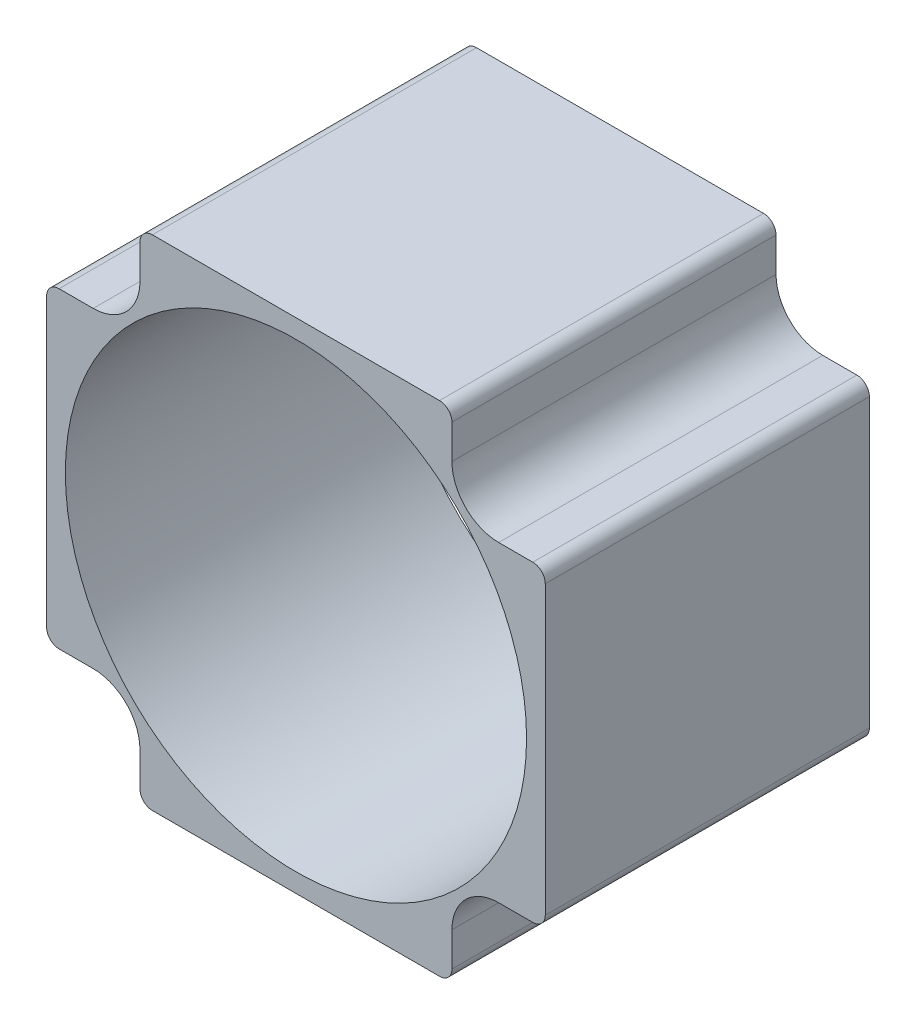
ISO-10303-21;
HEADER;
FILE_DESCRIPTION(('STEP AP214'),'2;1');
FILE_NAME('part.step','',(''),(''),'','','');
FILE_SCHEMA(('AUTOMOTIVE_DESIGN { 1 0 10303 214 1 1 1 1 }'));
ENDSEC;
DATA;
#1=APPLICATION_CONTEXT('core data for automotive mechanical design processes');
#2=APPLICATION_PROTOCOL_DEFINITION('international standard','automotive_design',2000,#1);
#3=PRODUCT_CONTEXT('',#1,'mechanical');
#4=PRODUCT('Part','Part','',(#3));
#5=PRODUCT_RELATED_PRODUCT_CATEGORY('part','',(#4));
#6=PRODUCT_DEFINITION_FORMATION('','',#4);
#7=PRODUCT_DEFINITION_CONTEXT('part definition',#1,'design');
#8=PRODUCT_DEFINITION('design','',#6,#7);
#9=PRODUCT_DEFINITION_SHAPE('','',#8);
#10=(LENGTH_UNIT() NAMED_UNIT(*) SI_UNIT(.MILLI.,.METRE.));
#11=(NAMED_UNIT(*) PLANE_ANGLE_UNIT() SI_UNIT($,.RADIAN.));
#12=(NAMED_UNIT(*) SI_UNIT($,.STERADIAN.) SOLID_ANGLE_UNIT());
#13=UNCERTAINTY_MEASURE_WITH_UNIT(LENGTH_MEASURE(1.E-05),#10,'distance_accuracy_value','');
#14=(GEOMETRIC_REPRESENTATION_CONTEXT(3) GLOBAL_UNCERTAINTY_ASSIGNED_CONTEXT((#13)) GLOBAL_UNIT_ASSIGNED_CONTEXT((#10,
#11,#12)) REPRESENTATION_CONTEXT('',''));
#15=CARTESIAN_POINT('',(0.,0.,0.));
#16=DIRECTION('',(0.,0.,1.));
#17=DIRECTION('',(1.,0.,0.));
#18=AXIS2_PLACEMENT_3D('',#15,#16,#17);
#19=CARTESIAN_POINT('',(0.,0.,-7.));
#20=DIRECTION('',(0.,0.,-1.));
#21=DIRECTION('',(-1.,0.,0.));
#22=AXIS2_PLACEMENT_3D('',#19,#20,#21);
#23=PLANE('',#22);
#24=CARTESIAN_POINT('',(0.,0.,-7.));
#25=DIRECTION('',(0.,0.,1.));
#26=DIRECTION('',(1.,0.,0.));
#27=AXIS2_PLACEMENT_3D('',#24,#25,#26);
#28=CIRCLE('',#27,18.5);
#29=CARTESIAN_POINT('',(18.5,0.,-7.));
#30=VERTEX_POINT('',#29);
#31=EDGE_CURVE('E314',#30,#30,#28,.T.);
#32=ORIENTED_EDGE('',*,*,#31,.F.);
#33=EDGE_LOOP('',(#32));
#34=FACE_BOUND('',#33,.T.);
#35=DIRECTION('',(1.,0.,0.));
#36=VECTOR('',#35,1.);
#37=CARTESIAN_POINT('',(-16.2634559672906,20.,-7.));
#38=LINE('',#37,#36);
#39=CARTESIAN_POINT('',(-11.5134559672906,20.,-7.));
#40=VERTEX_POINT('',#39);
#41=CARTESIAN_POINT('',(11.5134559672906,20.,-7.));
#42=VERTEX_POINT('',#41);
#43=EDGE_CURVE('E320',#40,#42,#38,.T.);
#44=ORIENTED_EDGE('',*,*,#43,.F.);
#45=CARTESIAN_POINT('',(-11.5134559672906,19.,-7.));
#46=DIRECTION('',(0.,0.,-1.));
#47=DIRECTION('',(-1.,0.,0.));
#48=AXIS2_PLACEMENT_3D('',#45,#46,#47);
#49=CIRCLE('',#48,1.);
#50=CARTESIAN_POINT('',(-12.5134559672906,19.,-7.));
#51=VERTEX_POINT('',#50);
#52=EDGE_CURVE('E362',#40,#51,#49,.F.);
#53=ORIENTED_EDGE('',*,*,#52,.T.);
#54=DIRECTION('',(0.,-1.,0.));
#55=VECTOR('',#54,1.);
#56=CARTESIAN_POINT('',(-12.5134559672906,0.,-7.));
#57=LINE('',#56,#55);
#58=CARTESIAN_POINT('',(-12.5134559672906,16.2634559672906,-7.));
#59=VERTEX_POINT('',#58);
#60=EDGE_CURVE('E312',#51,#59,#57,.T.);
#61=ORIENTED_EDGE('',*,*,#60,.T.);
#62=CARTESIAN_POINT('',(-16.2634559672906,16.2634559672906,-7.));
#63=DIRECTION('',(0.,0.,-1.));
#64=DIRECTION('',(-1.,0.,0.));
#65=AXIS2_PLACEMENT_3D('',#62,#63,#64);
#66=CIRCLE('',#65,3.75);
#67=CARTESIAN_POINT('',(-16.2634559672906,12.5134559672906,-7.));
#68=VERTEX_POINT('',#67);
#69=EDGE_CURVE('E309',#59,#68,#66,.T.);
#70=ORIENTED_EDGE('',*,*,#69,.T.);
#71=DIRECTION('',(-1.,0.,0.));
#72=VECTOR('',#71,1.);
#73=CARTESIAN_POINT('',(0.,12.5134559672906,-7.));
#74=LINE('',#73,#72);
#75=CARTESIAN_POINT('',(-19.,12.5134559672906,-7.));
#76=VERTEX_POINT('',#75);
#77=EDGE_CURVE('E306',#68,#76,#74,.T.);
#78=ORIENTED_EDGE('',*,*,#77,.T.);
#79=CARTESIAN_POINT('',(-19.,11.5134559672906,-7.));
#80=DIRECTION('',(0.,0.,-1.));
#81=DIRECTION('',(-1.,0.,0.));
#82=AXIS2_PLACEMENT_3D('',#79,#80,#81);
#83=CIRCLE('',#82,1.);
#84=CARTESIAN_POINT('',(-20.,11.5134559672906,-7.));
#85=VERTEX_POINT('',#84);
#86=EDGE_CURVE('E360',#76,#85,#83,.F.);
#87=ORIENTED_EDGE('',*,*,#86,.T.);
#88=DIRECTION('',(0.,1.,0.));
#89=VECTOR('',#88,1.);
#90=CARTESIAN_POINT('',(-20.,16.2634559672906,-7.));
#91=LINE('',#90,#89);
#92=CARTESIAN_POINT('',(-20.,-11.5134559672906,-7.));
#93=VERTEX_POINT('',#92);
#94=EDGE_CURVE('E338',#93,#85,#91,.T.);
#95=ORIENTED_EDGE('',*,*,#94,.F.);
#96=CARTESIAN_POINT('',(-19.,-11.5134559672906,-7.));
#97=DIRECTION('',(0.,0.,-1.));
#98=DIRECTION('',(-1.,0.,0.));
#99=AXIS2_PLACEMENT_3D('',#96,#97,#98);
#100=CIRCLE('',#99,1.);
#101=CARTESIAN_POINT('',(-19.,-12.5134559672906,-7.));
#102=VERTEX_POINT('',#101);
#103=EDGE_CURVE('E358',#93,#102,#100,.F.);
#104=ORIENTED_EDGE('',*,*,#103,.T.);
#105=DIRECTION('',(1.,0.,0.));
#106=VECTOR('',#105,1.);
#107=CARTESIAN_POINT('',(0.,-12.5134559672906,-7.));
#108=LINE('',#107,#106);
#109=CARTESIAN_POINT('',(-16.2634559672906,-12.5134559672906,-7.));
#110=VERTEX_POINT('',#109);
#111=EDGE_CURVE('E290',#102,#110,#108,.T.);
#112=ORIENTED_EDGE('',*,*,#111,.T.);
#113=CARTESIAN_POINT('',(-16.2634559672906,-16.2634559672906,-7.));
#114=DIRECTION('',(0.,0.,-1.));
#115=DIRECTION('',(-1.,0.,0.));
#116=AXIS2_PLACEMENT_3D('',#113,#114,#115);
#117=CIRCLE('',#116,3.75);
#118=CARTESIAN_POINT('',(-12.5134559672906,-16.2634559672906,-7.));
#119=VERTEX_POINT('',#118);
#120=EDGE_CURVE('E287',#110,#119,#117,.T.);
#121=ORIENTED_EDGE('',*,*,#120,.T.);
#122=DIRECTION('',(0.,-1.,0.));
#123=VECTOR('',#122,1.);
#124=CARTESIAN_POINT('',(-12.5134559672906,0.,-7.));
#125=LINE('',#124,#123);
#126=CARTESIAN_POINT('',(-12.5134559672906,-19.,-7.));
#127=VERTEX_POINT('',#126);
#128=EDGE_CURVE('E282',#119,#127,#125,.T.);
#129=ORIENTED_EDGE('',*,*,#128,.T.);
#130=CARTESIAN_POINT('',(-11.5134559672906,-19.,-7.));
#131=DIRECTION('',(0.,0.,-1.));
#132=DIRECTION('',(-1.,0.,0.));
#133=AXIS2_PLACEMENT_3D('',#130,#131,#132);
#134=CIRCLE('',#133,1.);
#135=CARTESIAN_POINT('',(-11.5134559672906,-20.,-7.));
#136=VERTEX_POINT('',#135);
#137=EDGE_CURVE('E356',#127,#136,#134,.F.);
#138=ORIENTED_EDGE('',*,*,#137,.T.);
#139=DIRECTION('',(-1.,0.,0.));
#140=VECTOR('',#139,1.);
#141=CARTESIAN_POINT('',(-16.2634559672906,-20.,-7.));
#142=LINE('',#141,#140);
#143=CARTESIAN_POINT('',(11.5134559672906,-20.,-7.));
#144=VERTEX_POINT('',#143);
#145=EDGE_CURVE('E332',#144,#136,#142,.T.);
#146=ORIENTED_EDGE('',*,*,#145,.F.);
#147=CARTESIAN_POINT('',(11.5134559672906,-19.,-7.));
#148=DIRECTION('',(0.,0.,-1.));
#149=DIRECTION('',(-1.,0.,0.));
#150=AXIS2_PLACEMENT_3D('',#147,#148,#149);
#151=CIRCLE('',#150,1.);
#152=CARTESIAN_POINT('',(12.5134559672906,-19.,-7.));
#153=VERTEX_POINT('',#152);
#154=EDGE_CURVE('E354',#144,#153,#151,.F.);
#155=ORIENTED_EDGE('',*,*,#154,.T.);
#156=DIRECTION('',(0.,1.,0.));
#157=VECTOR('',#156,1.);
#158=CARTESIAN_POINT('',(12.5134559672906,0.,-7.));
#159=LINE('',#158,#157);
#160=CARTESIAN_POINT('',(12.5134559672906,-16.2634559672906,-7.));
#161=VERTEX_POINT('',#160);
#162=EDGE_CURVE('E296',#153,#161,#159,.T.);
#163=ORIENTED_EDGE('',*,*,#162,.T.);
#164=CARTESIAN_POINT('',(16.2634559672906,-16.2634559672906,-7.));
#165=DIRECTION('',(0.,0.,-1.));
#166=DIRECTION('',(-1.,0.,0.));
#167=AXIS2_PLACEMENT_3D('',#164,#165,#166);
#168=CIRCLE('',#167,3.74999999999999);
#169=CARTESIAN_POINT('',(16.2634559672906,-12.5134559672906,-7.));
#170=VERTEX_POINT('',#169);
#171=EDGE_CURVE('E224',#161,#170,#168,.T.);
#172=ORIENTED_EDGE('',*,*,#171,.T.);
#173=DIRECTION('',(1.,0.,0.));
#174=VECTOR('',#173,1.);
#175=CARTESIAN_POINT('',(0.,-12.5134559672906,-7.));
#176=LINE('',#175,#174);
#177=CARTESIAN_POINT('',(19.,-12.5134559672906,-7.));
#178=VERTEX_POINT('',#177);
#179=EDGE_CURVE('E292',#170,#178,#176,.T.);
#180=ORIENTED_EDGE('',*,*,#179,.T.);
#181=CARTESIAN_POINT('',(19.,-11.5134559672906,-7.));
#182=DIRECTION('',(0.,0.,-1.));
#183=DIRECTION('',(-1.,0.,0.));
#184=AXIS2_PLACEMENT_3D('',#181,#182,#183);
#185=CIRCLE('',#184,1.);
#186=CARTESIAN_POINT('',(20.,-11.5134559672906,-7.));
#187=VERTEX_POINT('',#186);
#188=EDGE_CURVE('E352',#178,#187,#185,.F.);
#189=ORIENTED_EDGE('',*,*,#188,.T.);
#190=DIRECTION('',(0.,-1.,0.));
#191=VECTOR('',#190,1.);
#192=CARTESIAN_POINT('',(20.,16.2634559672906,-7.));
#193=LINE('',#192,#191);
#194=CARTESIAN_POINT('',(20.,11.5134559672906,-7.));
#195=VERTEX_POINT('',#194);
#196=EDGE_CURVE('E326',#195,#187,#193,.T.);
#197=ORIENTED_EDGE('',*,*,#196,.F.);
#198=CARTESIAN_POINT('',(19.,11.5134559672906,-7.));
#199=DIRECTION('',(0.,0.,-1.));
#200=DIRECTION('',(-1.,0.,0.));
#201=AXIS2_PLACEMENT_3D('',#198,#199,#200);
#202=CIRCLE('',#201,1.);
#203=CARTESIAN_POINT('',(19.,12.5134559672906,-7.));
#204=VERTEX_POINT('',#203);
#205=EDGE_CURVE('E350',#195,#204,#202,.F.);
#206=ORIENTED_EDGE('',*,*,#205,.T.);
#207=DIRECTION('',(-1.,0.,0.));
#208=VECTOR('',#207,1.);
#209=CARTESIAN_POINT('',(0.,12.5134559672906,-7.));
#210=LINE('',#209,#208);
#211=CARTESIAN_POINT('',(16.2634559672906,12.5134559672906,-7.));
#212=VERTEX_POINT('',#211);
#213=EDGE_CURVE('E304',#204,#212,#210,.T.);
#214=ORIENTED_EDGE('',*,*,#213,.T.);
#215=CARTESIAN_POINT('',(16.2634559672906,16.2634559672906,-7.));
#216=DIRECTION('',(0.,0.,-1.));
#217=DIRECTION('',(-1.,0.,0.));
#218=AXIS2_PLACEMENT_3D('',#215,#216,#217);
#219=CIRCLE('',#218,3.75);
#220=CARTESIAN_POINT('',(12.5134559672906,16.2634559672906,-7.));
#221=VERTEX_POINT('',#220);
#222=EDGE_CURVE('E301',#212,#221,#219,.T.);
#223=ORIENTED_EDGE('',*,*,#222,.T.);
#224=DIRECTION('',(0.,1.,0.));
#225=VECTOR('',#224,1.);
#226=CARTESIAN_POINT('',(12.5134559672906,0.,-7.));
#227=LINE('',#226,#225);
#228=CARTESIAN_POINT('',(12.5134559672906,19.,-7.));
#229=VERTEX_POINT('',#228);
#230=EDGE_CURVE('E298',#221,#229,#227,.T.);
#231=ORIENTED_EDGE('',*,*,#230,.T.);
#232=CARTESIAN_POINT('',(11.5134559672906,19.,-7.));
#233=DIRECTION('',(0.,0.,-1.));
#234=DIRECTION('',(-1.,0.,0.));
#235=AXIS2_PLACEMENT_3D('',#232,#233,#234);
#236=CIRCLE('',#235,1.);
#237=EDGE_CURVE('E348',#229,#42,#236,.F.);
#238=ORIENTED_EDGE('',*,*,#237,.T.);
#239=EDGE_LOOP('',(#44,#53,#61,#70,#78,#87,#95,#104,#112,#121,#129,#138,#146,#155,#163,#172,
#180,#189,#197,#206,#214,#223,#231,#238));
#240=FACE_BOUND('',#239,.T.);
#241=ADVANCED_FACE('F53',(#34,#240),#23,.F.);
#242=CARTESIAN_POINT('',(-16.2634559672906,20.,0.));
#243=DIRECTION('',(0.,-1.,0.));
#244=DIRECTION('',(0.,0.,-1.));
#245=AXIS2_PLACEMENT_3D('',#242,#243,#244);
#246=PLANE('',#245);
#247=DIRECTION('',(-1.,0.,0.));
#248=VECTOR('',#247,1.);
#249=CARTESIAN_POINT('',(-16.2634559672906,20.,-33.));
#250=LINE('',#249,#248);
#251=CARTESIAN_POINT('',(11.5134559672906,20.,-33.));
#252=VERTEX_POINT('',#251);
#253=CARTESIAN_POINT('',(-11.5134559672906,20.,-33.));
#254=VERTEX_POINT('',#253);
#255=EDGE_CURVE('E323',#252,#254,#250,.T.);
#256=ORIENTED_EDGE('',*,*,#255,.T.);
#257=DIRECTION('',(0.,0.,1.));
#258=VECTOR('',#257,1.);
#259=CARTESIAN_POINT('',(-11.5134559672906,20.,0.));
#260=LINE('',#259,#258);
#261=EDGE_CURVE('E345',#254,#40,#260,.T.);
#262=ORIENTED_EDGE('',*,*,#261,.T.);
#263=ORIENTED_EDGE('',*,*,#43,.T.);
#264=DIRECTION('',(0.,0.,1.));
#265=VECTOR('',#264,1.);
#266=CARTESIAN_POINT('',(11.5134559672906,20.,0.));
#267=LINE('',#266,#265);
#268=EDGE_CURVE('E343',#42,#252,#267,.F.);
#269=ORIENTED_EDGE('',*,*,#268,.T.);
#270=EDGE_LOOP('',(#256,#262,#263,#269));
#271=FACE_BOUND('',#270,.T.);
#272=ADVANCED_FACE('F482',(#271),#246,.F.);
#273=CARTESIAN_POINT('',(20.,16.2634559672906,0.));
#274=DIRECTION('',(-1.,0.,0.));
#275=DIRECTION('',(0.,-1.,0.));
#276=AXIS2_PLACEMENT_3D('',#273,#274,#275);
#277=PLANE('',#276);
#278=ORIENTED_EDGE('',*,*,#196,.T.);
#279=DIRECTION('',(0.,0.,1.));
#280=VECTOR('',#279,1.);
#281=CARTESIAN_POINT('',(20.,-11.5134559672906,0.));
#282=LINE('',#281,#280);
#283=CARTESIAN_POINT('',(20.,-11.5134559672906,-33.));
#284=VERTEX_POINT('',#283);
#285=EDGE_CURVE('E405',#187,#284,#282,.F.);
#286=ORIENTED_EDGE('',*,*,#285,.T.);
#287=DIRECTION('',(0.,1.,0.));
#288=VECTOR('',#287,1.);
#289=CARTESIAN_POINT('',(20.,16.2634559672906,-33.));
#290=LINE('',#289,#288);
#291=CARTESIAN_POINT('',(20.,11.5134559672906,-33.));
#292=VERTEX_POINT('',#291);
#293=EDGE_CURVE('E329',#284,#292,#290,.T.);
#294=ORIENTED_EDGE('',*,*,#293,.T.);
#295=DIRECTION('',(0.,0.,1.));
#296=VECTOR('',#295,1.);
#297=CARTESIAN_POINT('',(20.,11.5134559672906,0.));
#298=LINE('',#297,#296);
#299=EDGE_CURVE('E402',#292,#195,#298,.T.);
#300=ORIENTED_EDGE('',*,*,#299,.T.);
#301=EDGE_LOOP('',(#278,#286,#294,#300));
#302=FACE_BOUND('',#301,.T.);
#303=ADVANCED_FACE('F419',(#302),#277,.F.);
#304=CARTESIAN_POINT('',(-16.2634559672906,-20.,0.));
#305=DIRECTION('',(0.,1.,0.));
#306=DIRECTION('',(-1.,0.,0.));
#307=AXIS2_PLACEMENT_3D('',#304,#305,#306);
#308=PLANE('',#307);
#309=ORIENTED_EDGE('',*,*,#145,.T.);
#310=DIRECTION('',(0.,0.,1.));
#311=VECTOR('',#310,1.);
#312=CARTESIAN_POINT('',(-11.5134559672906,-20.,0.));
#313=LINE('',#312,#311);
#314=CARTESIAN_POINT('',(-11.5134559672906,-20.,-33.));
#315=VERTEX_POINT('',#314);
#316=EDGE_CURVE('E396',#136,#315,#313,.F.);
#317=ORIENTED_EDGE('',*,*,#316,.T.);
#318=DIRECTION('',(1.,0.,0.));
#319=VECTOR('',#318,1.);
#320=CARTESIAN_POINT('',(-16.2634559672906,-20.,-33.));
#321=LINE('',#320,#319);
#322=CARTESIAN_POINT('',(11.5134559672906,-20.,-33.));
#323=VERTEX_POINT('',#322);
#324=EDGE_CURVE('E335',#315,#323,#321,.T.);
#325=ORIENTED_EDGE('',*,*,#324,.T.);
#326=DIRECTION('',(0.,0.,1.));
#327=VECTOR('',#326,1.);
#328=CARTESIAN_POINT('',(11.5134559672906,-20.,0.));
#329=LINE('',#328,#327);
#330=EDGE_CURVE('E393',#323,#144,#329,.T.);
#331=ORIENTED_EDGE('',*,*,#330,.T.);
#332=EDGE_LOOP('',(#309,#317,#325,#331));
#333=FACE_BOUND('',#332,.T.);
#334=ADVANCED_FACE('F436',(#333),#308,.F.);
#335=CARTESIAN_POINT('',(-20.,16.2634559672906,0.));
#336=DIRECTION('',(1.,0.,0.));
#337=DIRECTION('',(0.,0.,-1.));
#338=AXIS2_PLACEMENT_3D('',#335,#336,#337);
#339=PLANE('',#338);
#340=ORIENTED_EDGE('',*,*,#94,.T.);
#341=DIRECTION('',(0.,0.,1.));
#342=VECTOR('',#341,1.);
#343=CARTESIAN_POINT('',(-20.,11.5134559672906,0.));
#344=LINE('',#343,#342);
#345=CARTESIAN_POINT('',(-20.,11.5134559672906,-33.));
#346=VERTEX_POINT('',#345);
#347=EDGE_CURVE('E386',#85,#346,#344,.F.);
#348=ORIENTED_EDGE('',*,*,#347,.T.);
#349=DIRECTION('',(0.,-1.,0.));
#350=VECTOR('',#349,1.);
#351=CARTESIAN_POINT('',(-20.,16.2634559672906,-33.));
#352=LINE('',#351,#350);
#353=CARTESIAN_POINT('',(-20.,-11.5134559672906,-33.));
#354=VERTEX_POINT('',#353);
#355=EDGE_CURVE('E341',#346,#354,#352,.T.);
#356=ORIENTED_EDGE('',*,*,#355,.T.);
#357=DIRECTION('',(0.,0.,1.));
#358=VECTOR('',#357,1.);
#359=CARTESIAN_POINT('',(-20.,-11.5134559672906,0.));
#360=LINE('',#359,#358);
#361=EDGE_CURVE('E383',#354,#93,#360,.T.);
#362=ORIENTED_EDGE('',*,*,#361,.T.);
#363=EDGE_LOOP('',(#340,#348,#356,#362));
#364=FACE_BOUND('',#363,.T.);
#365=ADVANCED_FACE('F459',(#364),#339,.F.);
#366=CARTESIAN_POINT('',(0.,0.,-33.));
#367=DIRECTION('',(0.,0.,1.));
#368=DIRECTION('',(1.,0.,0.));
#369=AXIS2_PLACEMENT_3D('',#366,#367,#368);
#370=PLANE('',#369);
#371=CARTESIAN_POINT('',(0.,0.,-33.));
#372=DIRECTION('',(0.,0.,1.));
#373=DIRECTION('',(1.,0.,0.));
#374=AXIS2_PLACEMENT_3D('',#371,#372,#373);
#375=CIRCLE('',#374,18.5);
#376=CARTESIAN_POINT('',(18.5,0.,-33.));
#377=VERTEX_POINT('',#376);
#378=EDGE_CURVE('E317',#377,#377,#375,.T.);
#379=ORIENTED_EDGE('',*,*,#378,.T.);
#380=EDGE_LOOP('',(#379));
#381=FACE_BOUND('',#380,.T.);
#382=DIRECTION('',(0.,1.,0.));
#383=VECTOR('',#382,1.);
#384=CARTESIAN_POINT('',(-12.5134559672906,20.,-33.));
#385=LINE('',#384,#383);
#386=CARTESIAN_POINT('',(-12.5134559672906,16.2634559672906,-33.));
#387=VERTEX_POINT('',#386);
#388=CARTESIAN_POINT('',(-12.5134559672906,19.,-33.));
#389=VERTEX_POINT('',#388);
#390=EDGE_CURVE('E265',#387,#389,#385,.T.);
#391=ORIENTED_EDGE('',*,*,#390,.T.);
#392=CARTESIAN_POINT('',(-11.5134559672906,19.,-33.));
#393=DIRECTION('',(0.,0.,1.));
#394=DIRECTION('',(1.,0.,0.));
#395=AXIS2_PLACEMENT_3D('',#392,#393,#394);
#396=CIRCLE('',#395,1.);
#397=EDGE_CURVE('E378',#389,#254,#396,.F.);
#398=ORIENTED_EDGE('',*,*,#397,.T.);
#399=ORIENTED_EDGE('',*,*,#255,.F.);
#400=CARTESIAN_POINT('',(11.5134559672906,19.,-33.));
#401=DIRECTION('',(0.,0.,1.));
#402=DIRECTION('',(1.,0.,0.));
#403=AXIS2_PLACEMENT_3D('',#400,#401,#402);
#404=CIRCLE('',#403,1.);
#405=CARTESIAN_POINT('',(12.5134559672906,19.,-33.));
#406=VERTEX_POINT('',#405);
#407=EDGE_CURVE('E366',#252,#406,#404,.F.);
#408=ORIENTED_EDGE('',*,*,#407,.T.);
#409=DIRECTION('',(0.,-1.,0.));
#410=VECTOR('',#409,1.);
#411=CARTESIAN_POINT('',(12.5134559672906,20.,-33.));
#412=LINE('',#411,#410);
#413=CARTESIAN_POINT('',(12.5134559672906,16.2634559672906,-33.));
#414=VERTEX_POINT('',#413);
#415=EDGE_CURVE('E246',#406,#414,#412,.T.);
#416=ORIENTED_EDGE('',*,*,#415,.T.);
#417=CARTESIAN_POINT('',(16.2634559672906,16.2634559672906,-33.));
#418=DIRECTION('',(0.,0.,1.));
#419=DIRECTION('',(1.,0.,0.));
#420=AXIS2_PLACEMENT_3D('',#417,#418,#419);
#421=CIRCLE('',#420,3.75);
#422=CARTESIAN_POINT('',(16.2634559672906,12.5134559672906,-33.));
#423=VERTEX_POINT('',#422);
#424=EDGE_CURVE('E248',#414,#423,#421,.T.);
#425=ORIENTED_EDGE('',*,*,#424,.T.);
#426=DIRECTION('',(1.,0.,0.));
#427=VECTOR('',#426,1.);
#428=CARTESIAN_POINT('',(16.2634559672906,12.5134559672906,-33.));
#429=LINE('',#428,#427);
#430=CARTESIAN_POINT('',(19.,12.5134559672906,-33.));
#431=VERTEX_POINT('',#430);
#432=EDGE_CURVE('E252',#423,#431,#429,.T.);
#433=ORIENTED_EDGE('',*,*,#432,.T.);
#434=CARTESIAN_POINT('',(19.,11.5134559672906,-33.));
#435=DIRECTION('',(0.,0.,1.));
#436=DIRECTION('',(1.,0.,0.));
#437=AXIS2_PLACEMENT_3D('',#434,#435,#436);
#438=CIRCLE('',#437,1.);
#439=EDGE_CURVE('E368',#431,#292,#438,.F.);
#440=ORIENTED_EDGE('',*,*,#439,.T.);
#441=ORIENTED_EDGE('',*,*,#293,.F.);
#442=CARTESIAN_POINT('',(19.,-11.5134559672906,-33.));
#443=DIRECTION('',(0.,0.,1.));
#444=DIRECTION('',(1.,0.,0.));
#445=AXIS2_PLACEMENT_3D('',#442,#443,#444);
#446=CIRCLE('',#445,1.);
#447=CARTESIAN_POINT('',(19.,-12.5134559672906,-33.));
#448=VERTEX_POINT('',#447);
#449=EDGE_CURVE('E370',#284,#448,#446,.F.);
#450=ORIENTED_EDGE('',*,*,#449,.T.);
#451=DIRECTION('',(-1.,0.,0.));
#452=VECTOR('',#451,1.);
#453=CARTESIAN_POINT('',(16.2634559672906,-12.5134559672906,-33.));
#454=LINE('',#453,#452);
#455=CARTESIAN_POINT('',(16.2634559672906,-12.5134559672906,-33.));
#456=VERTEX_POINT('',#455);
#457=EDGE_CURVE('E240',#448,#456,#454,.T.);
#458=ORIENTED_EDGE('',*,*,#457,.T.);
#459=CARTESIAN_POINT('',(16.2634559672906,-16.2634559672906,-33.));
#460=DIRECTION('',(0.,0.,1.));
#461=DIRECTION('',(1.,0.,0.));
#462=AXIS2_PLACEMENT_3D('',#459,#460,#461);
#463=CIRCLE('',#462,3.74999999999999);
#464=CARTESIAN_POINT('',(12.5134559672906,-16.2634559672906,-33.));
#465=VERTEX_POINT('',#464);
#466=EDGE_CURVE('E221',#456,#465,#463,.T.);
#467=ORIENTED_EDGE('',*,*,#466,.T.);
#468=DIRECTION('',(0.,-1.,0.));
#469=VECTOR('',#468,1.);
#470=CARTESIAN_POINT('',(12.5134559672906,-16.2634559672906,-33.));
#471=LINE('',#470,#469);
#472=CARTESIAN_POINT('',(12.5134559672906,-19.,-33.));
#473=VERTEX_POINT('',#472);
#474=EDGE_CURVE('E231',#465,#473,#471,.T.);
#475=ORIENTED_EDGE('',*,*,#474,.T.);
#476=CARTESIAN_POINT('',(11.5134559672906,-19.,-33.));
#477=DIRECTION('',(0.,0.,1.));
#478=DIRECTION('',(1.,0.,0.));
#479=AXIS2_PLACEMENT_3D('',#476,#477,#478);
#480=CIRCLE('',#479,1.);
#481=EDGE_CURVE('E372',#473,#323,#480,.F.);
#482=ORIENTED_EDGE('',*,*,#481,.T.);
#483=ORIENTED_EDGE('',*,*,#324,.F.);
#484=CARTESIAN_POINT('',(-11.5134559672906,-19.,-33.));
#485=DIRECTION('',(0.,0.,1.));
#486=DIRECTION('',(1.,0.,0.));
#487=AXIS2_PLACEMENT_3D('',#484,#485,#486);
#488=CIRCLE('',#487,1.);
#489=CARTESIAN_POINT('',(-12.5134559672906,-19.,-33.));
#490=VERTEX_POINT('',#489);
#491=EDGE_CURVE('E374',#315,#490,#488,.F.);
#492=ORIENTED_EDGE('',*,*,#491,.T.);
#493=DIRECTION('',(0.,1.,0.));
#494=VECTOR('',#493,1.);
#495=CARTESIAN_POINT('',(-12.5134559672906,-16.2634559672906,-33.));
#496=LINE('',#495,#494);
#497=CARTESIAN_POINT('',(-12.5134559672906,-16.2634559672906,-33.));
#498=VERTEX_POINT('',#497);
#499=EDGE_CURVE('E227',#490,#498,#496,.T.);
#500=ORIENTED_EDGE('',*,*,#499,.T.);
#501=CARTESIAN_POINT('',(-16.2634559672906,-16.2634559672906,-33.));
#502=DIRECTION('',(0.,0.,1.));
#503=DIRECTION('',(1.,0.,0.));
#504=AXIS2_PLACEMENT_3D('',#501,#502,#503);
#505=CIRCLE('',#504,3.75);
#506=CARTESIAN_POINT('',(-16.2634559672906,-12.5134559672906,-33.));
#507=VERTEX_POINT('',#506);
#508=EDGE_CURVE('E273',#498,#507,#505,.T.);
#509=ORIENTED_EDGE('',*,*,#508,.T.);
#510=DIRECTION('',(-1.,0.,0.));
#511=VECTOR('',#510,1.);
#512=CARTESIAN_POINT('',(-20.,-12.5134559672906,-33.));
#513=LINE('',#512,#511);
#514=CARTESIAN_POINT('',(-19.,-12.5134559672906,-33.));
#515=VERTEX_POINT('',#514);
#516=EDGE_CURVE('E276',#507,#515,#513,.T.);
#517=ORIENTED_EDGE('',*,*,#516,.T.);
#518=CARTESIAN_POINT('',(-19.,-11.5134559672906,-33.));
#519=DIRECTION('',(0.,0.,1.));
#520=DIRECTION('',(1.,0.,0.));
#521=AXIS2_PLACEMENT_3D('',#518,#519,#520);
#522=CIRCLE('',#521,1.);
#523=EDGE_CURVE('E74',#515,#354,#522,.F.);
#524=ORIENTED_EDGE('',*,*,#523,.T.);
#525=ORIENTED_EDGE('',*,*,#355,.F.);
#526=CARTESIAN_POINT('',(-19.,11.5134559672906,-33.));
#527=DIRECTION('',(0.,0.,1.));
#528=DIRECTION('',(1.,0.,0.));
#529=AXIS2_PLACEMENT_3D('',#526,#527,#528);
#530=CIRCLE('',#529,1.);
#531=CARTESIAN_POINT('',(-19.,12.5134559672906,-33.));
#532=VERTEX_POINT('',#531);
#533=EDGE_CURVE('E68',#346,#532,#530,.F.);
#534=ORIENTED_EDGE('',*,*,#533,.T.);
#535=DIRECTION('',(1.,0.,0.));
#536=VECTOR('',#535,1.);
#537=CARTESIAN_POINT('',(-20.,12.5134559672906,-33.));
#538=LINE('',#537,#536);
#539=CARTESIAN_POINT('',(-16.2634559672906,12.5134559672906,-33.));
#540=VERTEX_POINT('',#539);
#541=EDGE_CURVE('E260',#532,#540,#538,.T.);
#542=ORIENTED_EDGE('',*,*,#541,.T.);
#543=CARTESIAN_POINT('',(-16.2634559672906,16.2634559672906,-33.));
#544=DIRECTION('',(0.,0.,1.));
#545=DIRECTION('',(1.,0.,0.));
#546=AXIS2_PLACEMENT_3D('',#543,#544,#545);
#547=CIRCLE('',#546,3.75);
#548=EDGE_CURVE('E262',#540,#387,#547,.T.);
#549=ORIENTED_EDGE('',*,*,#548,.T.);
#550=EDGE_LOOP('',(#391,#398,#399,#408,#416,#425,#433,#440,#441,#450,#458,#467,#475,#482,#483,
#492,#500,#509,#517,#524,#525,#534,#542,#549));
#551=FACE_BOUND('',#550,.T.);
#552=ADVANCED_FACE('F238',(#381,#551),#370,.F.);
#553=CARTESIAN_POINT('',(0.,0.,24.4));
#554=DIRECTION('',(0.,0.,1.));
#555=DIRECTION('',(1.,0.,0.));
#556=AXIS2_PLACEMENT_3D('',#553,#554,#555);
#557=CYLINDRICAL_SURFACE('',#556,18.5);
#558=ORIENTED_EDGE('',*,*,#31,.T.);
#559=EDGE_LOOP('',(#558));
#560=FACE_BOUND('',#559,.T.);
#561=ORIENTED_EDGE('',*,*,#378,.F.);
#562=EDGE_LOOP('',(#561));
#563=FACE_BOUND('',#562,.T.);
#564=ADVANCED_FACE('F503',(#560,#563),#557,.F.);
#565=CARTESIAN_POINT('',(-20.,-12.5134559672906,-33.));
#566=DIRECTION('',(0.,1.,0.));
#567=DIRECTION('',(0.,0.,1.));
#568=AXIS2_PLACEMENT_3D('',#565,#566,#567);
#569=PLANE('',#568);
#570=ORIENTED_EDGE('',*,*,#111,.F.);
#571=DIRECTION('',(0.,0.,1.));
#572=VECTOR('',#571,1.);
#573=CARTESIAN_POINT('',(-19.,-12.5134559672906,-33.));
#574=LINE('',#573,#572);
#575=EDGE_CURVE('E388',#102,#515,#574,.F.);
#576=ORIENTED_EDGE('',*,*,#575,.T.);
#577=ORIENTED_EDGE('',*,*,#516,.F.);
#578=DIRECTION('',(0.,0.,1.));
#579=VECTOR('',#578,1.);
#580=CARTESIAN_POINT('',(-16.2634559672906,-12.5134559672906,-33.));
#581=LINE('',#580,#579);
#582=EDGE_CURVE('E279',#507,#110,#581,.T.);
#583=ORIENTED_EDGE('',*,*,#582,.T.);
#584=EDGE_LOOP('',(#570,#576,#577,#583));
#585=FACE_BOUND('',#584,.T.);
#586=ADVANCED_FACE('F453',(#585),#569,.F.);
#587=CARTESIAN_POINT('',(-16.2634559672906,-16.2634559672906,-33.));
#588=DIRECTION('',(0.,0.,1.));
#589=DIRECTION('',(1.,0.,0.));
#590=AXIS2_PLACEMENT_3D('',#587,#588,#589);
#591=CYLINDRICAL_SURFACE('',#590,3.75);
#592=ORIENTED_EDGE('',*,*,#582,.F.);
#593=ORIENTED_EDGE('',*,*,#508,.F.);
#594=DIRECTION('',(0.,0.,1.));
#595=VECTOR('',#594,1.);
#596=CARTESIAN_POINT('',(-12.5134559672906,-16.2634559672906,-33.));
#597=LINE('',#596,#595);
#598=EDGE_CURVE('E278',#498,#119,#597,.T.);
#599=ORIENTED_EDGE('',*,*,#598,.T.);
#600=ORIENTED_EDGE('',*,*,#120,.F.);
#601=EDGE_LOOP('',(#592,#593,#599,#600));
#602=FACE_BOUND('',#601,.T.);
#603=ADVANCED_FACE('F448',(#602),#591,.F.);
#604=CARTESIAN_POINT('',(-12.5134559672906,-16.2634559672906,-33.));
#605=DIRECTION('',(1.,0.,0.));
#606=DIRECTION('',(0.,1.,0.));
#607=AXIS2_PLACEMENT_3D('',#604,#605,#606);
#608=PLANE('',#607);
#609=ORIENTED_EDGE('',*,*,#499,.F.);
#610=DIRECTION('',(0.,0.,1.));
#611=VECTOR('',#610,1.);
#612=CARTESIAN_POINT('',(-12.5134559672906,-19.,-33.));
#613=LINE('',#612,#611);
#614=EDGE_CURVE('E390',#490,#127,#613,.T.);
#615=ORIENTED_EDGE('',*,*,#614,.T.);
#616=ORIENTED_EDGE('',*,*,#128,.F.);
#617=ORIENTED_EDGE('',*,*,#598,.F.);
#618=EDGE_LOOP('',(#609,#615,#616,#617));
#619=FACE_BOUND('',#618,.T.);
#620=ADVANCED_FACE('F445',(#619),#608,.F.);
#621=CARTESIAN_POINT('',(12.5134559672906,-16.2634559672906,-33.));
#622=DIRECTION('',(-1.,0.,0.));
#623=DIRECTION('',(0.,0.,1.));
#624=AXIS2_PLACEMENT_3D('',#621,#622,#623);
#625=PLANE('',#624);
#626=ORIENTED_EDGE('',*,*,#162,.F.);
#627=DIRECTION('',(0.,0.,1.));
#628=VECTOR('',#627,1.);
#629=CARTESIAN_POINT('',(12.5134559672906,-19.,-33.));
#630=LINE('',#629,#628);
#631=EDGE_CURVE('E234',#153,#473,#630,.F.);
#632=ORIENTED_EDGE('',*,*,#631,.T.);
#633=ORIENTED_EDGE('',*,*,#474,.F.);
#634=DIRECTION('',(0.,0.,1.));
#635=VECTOR('',#634,1.);
#636=CARTESIAN_POINT('',(12.5134559672906,-16.2634559672906,-33.));
#637=LINE('',#636,#635);
#638=EDGE_CURVE('E216',#465,#161,#637,.T.);
#639=ORIENTED_EDGE('',*,*,#638,.T.);
#640=EDGE_LOOP('',(#626,#632,#633,#639));
#641=FACE_BOUND('',#640,.T.);
#642=ADVANCED_FACE('F232',(#641),#625,.F.);
#643=CARTESIAN_POINT('',(16.2634559672906,-16.2634559672906,-33.));
#644=DIRECTION('',(0.,0.,1.));
#645=DIRECTION('',(1.,0.,0.));
#646=AXIS2_PLACEMENT_3D('',#643,#644,#645);
#647=CYLINDRICAL_SURFACE('',#646,3.74999999999999);
#648=ORIENTED_EDGE('',*,*,#638,.F.);
#649=ORIENTED_EDGE('',*,*,#466,.F.);
#650=DIRECTION('',(0.,0.,1.));
#651=VECTOR('',#650,1.);
#652=CARTESIAN_POINT('',(16.2634559672906,-12.5134559672906,-33.));
#653=LINE('',#652,#651);
#654=EDGE_CURVE('E228',#456,#170,#653,.T.);
#655=ORIENTED_EDGE('',*,*,#654,.T.);
#656=ORIENTED_EDGE('',*,*,#171,.F.);
#657=EDGE_LOOP('',(#648,#649,#655,#656));
#658=FACE_BOUND('',#657,.T.);
#659=ADVANCED_FACE('F218',(#658),#647,.F.);
#660=CARTESIAN_POINT('',(16.2634559672906,-12.5134559672906,-33.));
#661=DIRECTION('',(0.,1.,0.));
#662=DIRECTION('',(-1.,0.,0.));
#663=AXIS2_PLACEMENT_3D('',#660,#661,#662);
#664=PLANE('',#663);
#665=ORIENTED_EDGE('',*,*,#457,.F.);
#666=DIRECTION('',(0.,0.,1.));
#667=VECTOR('',#666,1.);
#668=CARTESIAN_POINT('',(19.,-12.5134559672906,-33.));
#669=LINE('',#668,#667);
#670=EDGE_CURVE('E399',#448,#178,#669,.T.);
#671=ORIENTED_EDGE('',*,*,#670,.T.);
#672=ORIENTED_EDGE('',*,*,#179,.F.);
#673=ORIENTED_EDGE('',*,*,#654,.F.);
#674=EDGE_LOOP('',(#665,#671,#672,#673));
#675=FACE_BOUND('',#674,.T.);
#676=ADVANCED_FACE('F428',(#675),#664,.F.);
#677=CARTESIAN_POINT('',(16.2634559672906,12.5134559672906,-33.));
#678=DIRECTION('',(0.,-1.,0.));
#679=DIRECTION('',(1.,0.,0.));
#680=AXIS2_PLACEMENT_3D('',#677,#678,#679);
#681=PLANE('',#680);
#682=ORIENTED_EDGE('',*,*,#213,.F.);
#683=DIRECTION('',(0.,0.,1.));
#684=VECTOR('',#683,1.);
#685=CARTESIAN_POINT('',(19.,12.5134559672906,-33.));
#686=LINE('',#685,#684);
#687=EDGE_CURVE('E61',#204,#431,#686,.F.);
#688=ORIENTED_EDGE('',*,*,#687,.T.);
#689=ORIENTED_EDGE('',*,*,#432,.F.);
#690=DIRECTION('',(0.,0.,1.));
#691=VECTOR('',#690,1.);
#692=CARTESIAN_POINT('',(16.2634559672906,12.5134559672906,-33.));
#693=LINE('',#692,#691);
#694=EDGE_CURVE('E242',#423,#212,#693,.T.);
#695=ORIENTED_EDGE('',*,*,#694,.T.);
#696=EDGE_LOOP('',(#682,#688,#689,#695));
#697=FACE_BOUND('',#696,.T.);
#698=ADVANCED_FACE('F410',(#697),#681,.F.);
#699=CARTESIAN_POINT('',(16.2634559672906,16.2634559672906,-33.));
#700=DIRECTION('',(0.,0.,1.));
#701=DIRECTION('',(1.,0.,0.));
#702=AXIS2_PLACEMENT_3D('',#699,#700,#701);
#703=CYLINDRICAL_SURFACE('',#702,3.75);
#704=ORIENTED_EDGE('',*,*,#694,.F.);
#705=ORIENTED_EDGE('',*,*,#424,.F.);
#706=DIRECTION('',(0.,0.,1.));
#707=VECTOR('',#706,1.);
#708=CARTESIAN_POINT('',(12.5134559672906,16.2634559672906,-33.));
#709=LINE('',#708,#707);
#710=EDGE_CURVE('E255',#414,#221,#709,.T.);
#711=ORIENTED_EDGE('',*,*,#710,.T.);
#712=ORIENTED_EDGE('',*,*,#222,.F.);
#713=EDGE_LOOP('',(#704,#705,#711,#712));
#714=FACE_BOUND('',#713,.T.);
#715=ADVANCED_FACE('F492',(#714),#703,.F.);
#716=CARTESIAN_POINT('',(12.5134559672906,20.,-33.));
#717=DIRECTION('',(-1.,0.,0.));
#718=DIRECTION('',(0.,-1.,0.));
#719=AXIS2_PLACEMENT_3D('',#716,#717,#718);
#720=PLANE('',#719);
#721=ORIENTED_EDGE('',*,*,#415,.F.);
#722=DIRECTION('',(0.,0.,1.));
#723=VECTOR('',#722,1.);
#724=CARTESIAN_POINT('',(12.5134559672906,19.,-33.));
#725=LINE('',#724,#723);
#726=EDGE_CURVE('E12',#406,#229,#725,.T.);
#727=ORIENTED_EDGE('',*,*,#726,.T.);
#728=ORIENTED_EDGE('',*,*,#230,.F.);
#729=ORIENTED_EDGE('',*,*,#710,.F.);
#730=EDGE_LOOP('',(#721,#727,#728,#729));
#731=FACE_BOUND('',#730,.T.);
#732=ADVANCED_FACE('F489',(#731),#720,.F.);
#733=CARTESIAN_POINT('',(-12.5134559672906,20.,-33.));
#734=DIRECTION('',(1.,0.,0.));
#735=DIRECTION('',(0.,0.,-1.));
#736=AXIS2_PLACEMENT_3D('',#733,#734,#735);
#737=PLANE('',#736);
#738=ORIENTED_EDGE('',*,*,#60,.F.);
#739=DIRECTION('',(0.,0.,1.));
#740=VECTOR('',#739,1.);
#741=CARTESIAN_POINT('',(-12.5134559672906,19.,-33.));
#742=LINE('',#741,#740);
#743=EDGE_CURVE('E364',#51,#389,#742,.F.);
#744=ORIENTED_EDGE('',*,*,#743,.T.);
#745=ORIENTED_EDGE('',*,*,#390,.F.);
#746=DIRECTION('',(0.,0.,1.));
#747=VECTOR('',#746,1.);
#748=CARTESIAN_POINT('',(-12.5134559672906,16.2634559672906,-33.));
#749=LINE('',#748,#747);
#750=EDGE_CURVE('E249',#387,#59,#749,.T.);
#751=ORIENTED_EDGE('',*,*,#750,.T.);
#752=EDGE_LOOP('',(#738,#744,#745,#751));
#753=FACE_BOUND('',#752,.T.);
#754=ADVANCED_FACE('F474',(#753),#737,.F.);
#755=CARTESIAN_POINT('',(-16.2634559672906,16.2634559672906,-33.));
#756=DIRECTION('',(0.,0.,1.));
#757=DIRECTION('',(1.,0.,0.));
#758=AXIS2_PLACEMENT_3D('',#755,#756,#757);
#759=CYLINDRICAL_SURFACE('',#758,3.75);
#760=ORIENTED_EDGE('',*,*,#750,.F.);
#761=ORIENTED_EDGE('',*,*,#548,.F.);
#762=DIRECTION('',(0.,0.,1.));
#763=VECTOR('',#762,1.);
#764=CARTESIAN_POINT('',(-16.2634559672906,12.5134559672906,-33.));
#765=LINE('',#764,#763);
#766=EDGE_CURVE('E267',#540,#68,#765,.T.);
#767=ORIENTED_EDGE('',*,*,#766,.T.);
#768=ORIENTED_EDGE('',*,*,#69,.F.);
#769=EDGE_LOOP('',(#760,#761,#767,#768));
#770=FACE_BOUND('',#769,.T.);
#771=ADVANCED_FACE('F469',(#770),#759,.F.);
#772=CARTESIAN_POINT('',(-20.,12.5134559672906,-33.));
#773=DIRECTION('',(0.,-1.,0.));
#774=DIRECTION('',(1.,0.,0.));
#775=AXIS2_PLACEMENT_3D('',#772,#773,#774);
#776=PLANE('',#775);
#777=ORIENTED_EDGE('',*,*,#541,.F.);
#778=DIRECTION('',(0.,0.,1.));
#779=VECTOR('',#778,1.);
#780=CARTESIAN_POINT('',(-19.,12.5134559672906,-33.));
#781=LINE('',#780,#779);
#782=EDGE_CURVE('E380',#532,#76,#781,.T.);
#783=ORIENTED_EDGE('',*,*,#782,.T.);
#784=ORIENTED_EDGE('',*,*,#77,.F.);
#785=ORIENTED_EDGE('',*,*,#766,.F.);
#786=EDGE_LOOP('',(#777,#783,#784,#785));
#787=FACE_BOUND('',#786,.T.);
#788=ADVANCED_FACE('F465',(#787),#776,.F.);
#789=CARTESIAN_POINT('',(-11.5134559672906,19.,0.));
#790=DIRECTION('',(0.,0.,1.));
#791=DIRECTION('',(1.,0.,0.));
#792=AXIS2_PLACEMENT_3D('',#789,#790,#791);
#793=CYLINDRICAL_SURFACE('',#792,1.);
#794=ORIENTED_EDGE('',*,*,#397,.F.);
#795=ORIENTED_EDGE('',*,*,#743,.F.);
#796=ORIENTED_EDGE('',*,*,#52,.F.);
#797=ORIENTED_EDGE('',*,*,#261,.F.);
#798=EDGE_LOOP('',(#794,#795,#796,#797));
#799=FACE_BOUND('',#798,.T.);
#800=ADVANCED_FACE('F480',(#799),#793,.T.);
#801=CARTESIAN_POINT('',(-19.,11.5134559672906,-33.));
#802=DIRECTION('',(0.,0.,1.));
#803=DIRECTION('',(1.,0.,0.));
#804=AXIS2_PLACEMENT_3D('',#801,#802,#803);
#805=CYLINDRICAL_SURFACE('',#804,1.);
#806=ORIENTED_EDGE('',*,*,#533,.F.);
#807=ORIENTED_EDGE('',*,*,#347,.F.);
#808=ORIENTED_EDGE('',*,*,#86,.F.);
#809=ORIENTED_EDGE('',*,*,#782,.F.);
#810=EDGE_LOOP('',(#806,#807,#808,#809));
#811=FACE_BOUND('',#810,.T.);
#812=ADVANCED_FACE('F463',(#811),#805,.T.);
#813=CARTESIAN_POINT('',(-19.,-11.5134559672906,0.));
#814=DIRECTION('',(0.,0.,1.));
#815=DIRECTION('',(1.,0.,0.));
#816=AXIS2_PLACEMENT_3D('',#813,#814,#815);
#817=CYLINDRICAL_SURFACE('',#816,1.);
#818=ORIENTED_EDGE('',*,*,#523,.F.);
#819=ORIENTED_EDGE('',*,*,#575,.F.);
#820=ORIENTED_EDGE('',*,*,#103,.F.);
#821=ORIENTED_EDGE('',*,*,#361,.F.);
#822=EDGE_LOOP('',(#818,#819,#820,#821));
#823=FACE_BOUND('',#822,.T.);
#824=ADVANCED_FACE('F456',(#823),#817,.T.);
#825=CARTESIAN_POINT('',(-11.5134559672906,-19.,-33.));
#826=DIRECTION('',(0.,0.,1.));
#827=DIRECTION('',(1.,0.,0.));
#828=AXIS2_PLACEMENT_3D('',#825,#826,#827);
#829=CYLINDRICAL_SURFACE('',#828,1.);
#830=ORIENTED_EDGE('',*,*,#491,.F.);
#831=ORIENTED_EDGE('',*,*,#316,.F.);
#832=ORIENTED_EDGE('',*,*,#137,.F.);
#833=ORIENTED_EDGE('',*,*,#614,.F.);
#834=EDGE_LOOP('',(#830,#831,#832,#833));
#835=FACE_BOUND('',#834,.T.);
#836=ADVANCED_FACE('F439',(#835),#829,.T.);
#837=CARTESIAN_POINT('',(11.5134559672906,-19.,0.));
#838=DIRECTION('',(0.,0.,1.));
#839=DIRECTION('',(1.,0.,0.));
#840=AXIS2_PLACEMENT_3D('',#837,#838,#839);
#841=CYLINDRICAL_SURFACE('',#840,1.);
#842=ORIENTED_EDGE('',*,*,#481,.F.);
#843=ORIENTED_EDGE('',*,*,#631,.F.);
#844=ORIENTED_EDGE('',*,*,#154,.F.);
#845=ORIENTED_EDGE('',*,*,#330,.F.);
#846=EDGE_LOOP('',(#842,#843,#844,#845));
#847=FACE_BOUND('',#846,.T.);
#848=ADVANCED_FACE('F431',(#847),#841,.T.);
#849=CARTESIAN_POINT('',(19.,-11.5134559672906,-33.));
#850=DIRECTION('',(0.,0.,1.));
#851=DIRECTION('',(1.,0.,0.));
#852=AXIS2_PLACEMENT_3D('',#849,#850,#851);
#853=CYLINDRICAL_SURFACE('',#852,1.);
#854=ORIENTED_EDGE('',*,*,#449,.F.);
#855=ORIENTED_EDGE('',*,*,#285,.F.);
#856=ORIENTED_EDGE('',*,*,#188,.F.);
#857=ORIENTED_EDGE('',*,*,#670,.F.);
#858=EDGE_LOOP('',(#854,#855,#856,#857));
#859=FACE_BOUND('',#858,.T.);
#860=ADVANCED_FACE('F426',(#859),#853,.T.);
#861=CARTESIAN_POINT('',(19.,11.5134559672906,0.));
#862=DIRECTION('',(0.,0.,1.));
#863=DIRECTION('',(1.,0.,0.));
#864=AXIS2_PLACEMENT_3D('',#861,#862,#863);
#865=CYLINDRICAL_SURFACE('',#864,1.);
#866=ORIENTED_EDGE('',*,*,#439,.F.);
#867=ORIENTED_EDGE('',*,*,#687,.F.);
#868=ORIENTED_EDGE('',*,*,#205,.F.);
#869=ORIENTED_EDGE('',*,*,#299,.F.);
#870=EDGE_LOOP('',(#866,#867,#868,#869));
#871=FACE_BOUND('',#870,.T.);
#872=ADVANCED_FACE('F416',(#871),#865,.T.);
#873=CARTESIAN_POINT('',(11.5134559672906,19.,-33.));
#874=DIRECTION('',(0.,0.,1.));
#875=DIRECTION('',(1.,0.,0.));
#876=AXIS2_PLACEMENT_3D('',#873,#874,#875);
#877=CYLINDRICAL_SURFACE('',#876,1.);
#878=ORIENTED_EDGE('',*,*,#407,.F.);
#879=ORIENTED_EDGE('',*,*,#268,.F.);
#880=ORIENTED_EDGE('',*,*,#237,.F.);
#881=ORIENTED_EDGE('',*,*,#726,.F.);
#882=EDGE_LOOP('',(#878,#879,#880,#881));
#883=FACE_BOUND('',#882,.T.);
#884=ADVANCED_FACE('F55',(#883),#877,.T.);
#885=CLOSED_SHELL('',(#241,#272,#303,#334,#365,#552,#564,#586,#603,#620,#642,#659,#676,#698,
#715,#732,#754,#771,#788,#800,#812,#824,#836,#848,#860,#872,#884));
#886=MANIFOLD_SOLID_BREP('B2',#885);
#887=ADVANCED_BREP_SHAPE_REPRESENTATION('',(#18,#886),#14);
#888=SHAPE_DEFINITION_REPRESENTATION(#9,#887);
ENDSEC;
END-ISO-10303-21;
